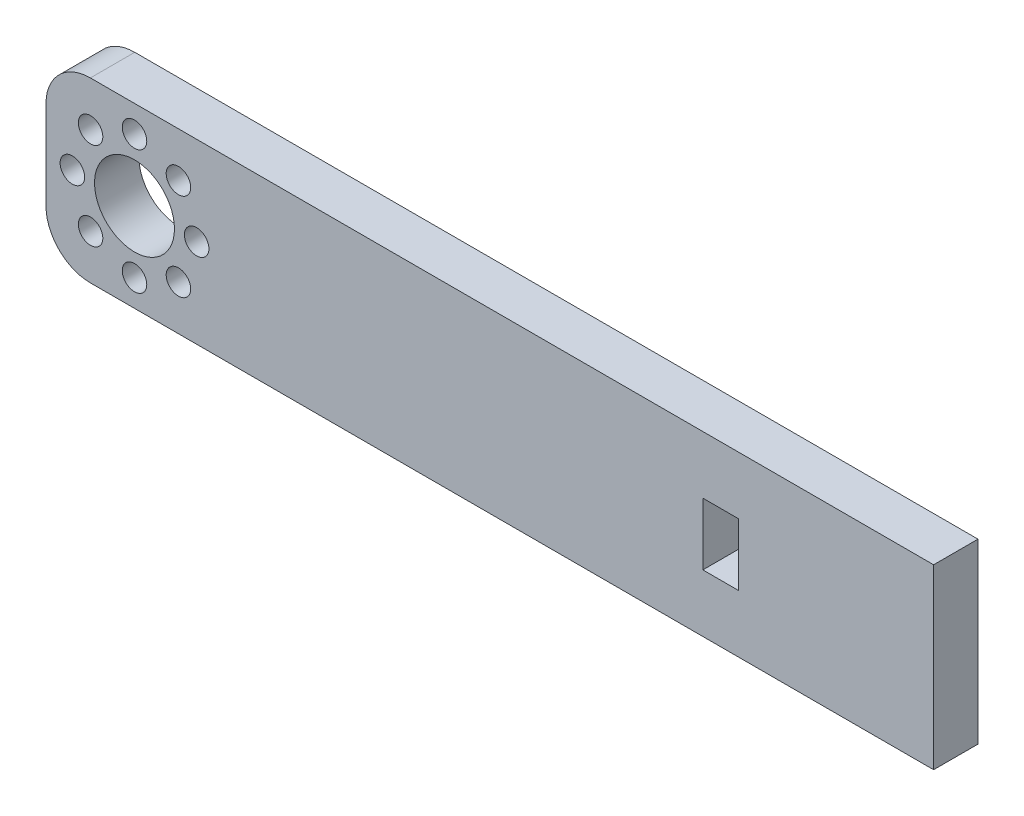
ISO-10303-21;
HEADER;
FILE_DESCRIPTION(('STEP AP214'),'2;1');
FILE_NAME('part.step','',(''),(''),'','','');
FILE_SCHEMA(('AUTOMOTIVE_DESIGN { 1 0 10303 214 1 1 1 1 }'));
ENDSEC;
DATA;
#1=APPLICATION_CONTEXT('core data for automotive mechanical design processes');
#2=APPLICATION_PROTOCOL_DEFINITION('international standard','automotive_design',2000,#1);
#3=PRODUCT_CONTEXT('',#1,'mechanical');
#4=PRODUCT('Part','Part','',(#3));
#5=PRODUCT_RELATED_PRODUCT_CATEGORY('part','',(#4));
#6=PRODUCT_DEFINITION_FORMATION('','',#4);
#7=PRODUCT_DEFINITION_CONTEXT('part definition',#1,'design');
#8=PRODUCT_DEFINITION('design','',#6,#7);
#9=PRODUCT_DEFINITION_SHAPE('','',#8);
#10=(LENGTH_UNIT() NAMED_UNIT(*) SI_UNIT(.MILLI.,.METRE.));
#11=(NAMED_UNIT(*) PLANE_ANGLE_UNIT() SI_UNIT($,.RADIAN.));
#12=(NAMED_UNIT(*) SI_UNIT($,.STERADIAN.) SOLID_ANGLE_UNIT());
#13=UNCERTAINTY_MEASURE_WITH_UNIT(LENGTH_MEASURE(1.E-05),#10,'distance_accuracy_value','');
#14=(GEOMETRIC_REPRESENTATION_CONTEXT(3) GLOBAL_UNCERTAINTY_ASSIGNED_CONTEXT((#13)) GLOBAL_UNIT_ASSIGNED_CONTEXT((#10,
#11,#12)) REPRESENTATION_CONTEXT('',''));
#15=CARTESIAN_POINT('',(0.,0.,0.));
#16=DIRECTION('',(0.,0.,1.));
#17=DIRECTION('',(1.,0.,0.));
#18=AXIS2_PLACEMENT_3D('',#15,#16,#17);
#19=CARTESIAN_POINT('',(-60.,10.,5.));
#20=DIRECTION('',(0.,-1.,0.));
#21=DIRECTION('',(1.,0.,0.));
#22=AXIS2_PLACEMENT_3D('',#19,#20,#21);
#23=PLANE('',#22);
#24=DIRECTION('',(0.,0.,-1.));
#25=VECTOR('',#24,1.);
#26=CARTESIAN_POINT('',(40.,10.,20.));
#27=LINE('',#26,#25);
#28=CARTESIAN_POINT('',(40.,10.,5.));
#29=VERTEX_POINT('',#28);
#30=CARTESIAN_POINT('',(40.,10.,0.));
#31=VERTEX_POINT('',#30);
#32=EDGE_CURVE('E143',#29,#31,#27,.T.);
#33=ORIENTED_EDGE('',*,*,#32,.T.);
#34=DIRECTION('',(-1.,0.,0.));
#35=VECTOR('',#34,1.);
#36=CARTESIAN_POINT('',(-60.,10.,0.));
#37=LINE('',#36,#35);
#38=CARTESIAN_POINT('',(-55.,10.,0.));
#39=VERTEX_POINT('',#38);
#40=EDGE_CURVE('E203',#31,#39,#37,.T.);
#41=ORIENTED_EDGE('',*,*,#40,.T.);
#42=DIRECTION('',(0.,0.,-1.));
#43=VECTOR('',#42,1.);
#44=CARTESIAN_POINT('',(-55.,10.,5.));
#45=LINE('',#44,#43);
#46=CARTESIAN_POINT('',(-55.,10.,5.));
#47=VERTEX_POINT('',#46);
#48=EDGE_CURVE('E229',#39,#47,#45,.F.);
#49=ORIENTED_EDGE('',*,*,#48,.T.);
#50=DIRECTION('',(-1.,0.,0.));
#51=VECTOR('',#50,1.);
#52=CARTESIAN_POINT('',(-60.,10.,5.));
#53=LINE('',#52,#51);
#54=EDGE_CURVE('E204',#29,#47,#53,.T.);
#55=ORIENTED_EDGE('',*,*,#54,.F.);
#56=EDGE_LOOP('',(#33,#41,#49,#55));
#57=FACE_BOUND('',#56,.T.);
#58=ADVANCED_FACE('F33',(#57),#23,.F.);
#59=CARTESIAN_POINT('',(-60.,-9.99999999999999,5.));
#60=DIRECTION('',(0.,1.,0.));
#61=DIRECTION('',(0.,0.,1.));
#62=AXIS2_PLACEMENT_3D('',#59,#60,#61);
#63=PLANE('',#62);
#64=DIRECTION('',(0.,0.,-1.));
#65=VECTOR('',#64,1.);
#66=CARTESIAN_POINT('',(40.,-9.99999999999999,20.));
#67=LINE('',#66,#65);
#68=CARTESIAN_POINT('',(40.,-9.99999999999999,5.));
#69=VERTEX_POINT('',#68);
#70=CARTESIAN_POINT('',(40.,-9.99999999999999,0.));
#71=VERTEX_POINT('',#70);
#72=EDGE_CURVE('E141',#69,#71,#67,.T.);
#73=ORIENTED_EDGE('',*,*,#72,.F.);
#74=DIRECTION('',(1.,0.,0.));
#75=VECTOR('',#74,1.);
#76=CARTESIAN_POINT('',(-60.,-9.99999999999999,5.));
#77=LINE('',#76,#75);
#78=CARTESIAN_POINT('',(-55.,-9.99999999999999,5.));
#79=VERTEX_POINT('',#78);
#80=EDGE_CURVE('E210',#79,#69,#77,.T.);
#81=ORIENTED_EDGE('',*,*,#80,.F.);
#82=DIRECTION('',(0.,0.,-1.));
#83=VECTOR('',#82,1.);
#84=CARTESIAN_POINT('',(-55.,-9.99999999999999,5.));
#85=LINE('',#84,#83);
#86=CARTESIAN_POINT('',(-55.,-9.99999999999999,0.));
#87=VERTEX_POINT('',#86);
#88=EDGE_CURVE('E236',#79,#87,#85,.T.);
#89=ORIENTED_EDGE('',*,*,#88,.T.);
#90=DIRECTION('',(1.,0.,0.));
#91=VECTOR('',#90,1.);
#92=CARTESIAN_POINT('',(-60.,-9.99999999999999,0.));
#93=LINE('',#92,#91);
#94=EDGE_CURVE('E207',#87,#71,#93,.T.);
#95=ORIENTED_EDGE('',*,*,#94,.T.);
#96=EDGE_LOOP('',(#73,#81,#89,#95));
#97=FACE_BOUND('',#96,.T.);
#98=ADVANCED_FACE('F262',(#97),#63,.F.);
#99=CARTESIAN_POINT('',(0.,0.,5.));
#100=DIRECTION('',(0.,0.,1.));
#101=DIRECTION('',(1.,0.,0.));
#102=AXIS2_PLACEMENT_3D('',#99,#100,#101);
#103=PLANE('',#102);
#104=DIRECTION('',(0.,-1.,0.));
#105=VECTOR('',#104,1.);
#106=CARTESIAN_POINT('',(14.,3.50000000000001,5.));
#107=LINE('',#106,#105);
#108=CARTESIAN_POINT('',(14.,3.50000000000001,5.));
#109=VERTEX_POINT('',#108);
#110=CARTESIAN_POINT('',(14.,-3.49999999999999,5.));
#111=VERTEX_POINT('',#110);
#112=EDGE_CURVE('E48',#109,#111,#107,.T.);
#113=ORIENTED_EDGE('',*,*,#112,.F.);
#114=DIRECTION('',(-1.,0.,0.));
#115=VECTOR('',#114,1.);
#116=CARTESIAN_POINT('',(14.,3.50000000000001,5.));
#117=LINE('',#116,#115);
#118=CARTESIAN_POINT('',(18.,3.50000000000001,5.));
#119=VERTEX_POINT('',#118);
#120=EDGE_CURVE('E129',#119,#109,#117,.T.);
#121=ORIENTED_EDGE('',*,*,#120,.F.);
#122=DIRECTION('',(0.,1.,0.));
#123=VECTOR('',#122,1.);
#124=CARTESIAN_POINT('',(18.,3.50000000000001,5.));
#125=LINE('',#124,#123);
#126=CARTESIAN_POINT('',(18.,-3.49999999999999,5.));
#127=VERTEX_POINT('',#126);
#128=EDGE_CURVE('E113',#127,#119,#125,.T.);
#129=ORIENTED_EDGE('',*,*,#128,.F.);
#130=DIRECTION('',(1.,0.,0.));
#131=VECTOR('',#130,1.);
#132=CARTESIAN_POINT('',(14.,-3.49999999999999,5.));
#133=LINE('',#132,#131);
#134=EDGE_CURVE('E122',#111,#127,#133,.T.);
#135=ORIENTED_EDGE('',*,*,#134,.F.);
#136=EDGE_LOOP('',(#113,#121,#129,#135));
#137=FACE_BOUND('',#136,.T.);
#138=CARTESIAN_POINT('',(-50.02901077957,7.,5.));
#139=DIRECTION('',(0.,0.,1.));
#140=DIRECTION('',(1.,0.,0.));
#141=AXIS2_PLACEMENT_3D('',#138,#139,#140);
#142=CIRCLE('',#141,1.380566099755);
#143=CARTESIAN_POINT('',(-48.648444679815,7.,5.));
#144=VERTEX_POINT('',#143);
#145=EDGE_CURVE('E200',#144,#144,#142,.F.);
#146=ORIENTED_EDGE('',*,*,#145,.T.);
#147=EDGE_LOOP('',(#146));
#148=FACE_BOUND('',#147,.T.);
#149=CARTESIAN_POINT('',(-45.0792633112641,4.94974746830595,5.));
#150=DIRECTION('',(0.,0.,1.));
#151=DIRECTION('',(1.,0.,0.));
#152=AXIS2_PLACEMENT_3D('',#149,#150,#151);
#153=CIRCLE('',#152,1.380566099755);
#154=CARTESIAN_POINT('',(-43.6986972115091,4.94974746830595,5.));
#155=VERTEX_POINT('',#154);
#156=EDGE_CURVE('E197',#155,#155,#153,.F.);
#157=ORIENTED_EDGE('',*,*,#156,.T.);
#158=EDGE_LOOP('',(#157));
#159=FACE_BOUND('',#158,.T.);
#160=CARTESIAN_POINT('',(-43.0290107795698,1.66533453693773E-13,5.));
#161=DIRECTION('',(0.,0.,1.));
#162=DIRECTION('',(1.,0.,0.));
#163=AXIS2_PLACEMENT_3D('',#160,#161,#162);
#164=CIRCLE('',#163,1.380566099755);
#165=CARTESIAN_POINT('',(-41.6484446798148,1.66533453693773E-13,5.));
#166=VERTEX_POINT('',#165);
#167=EDGE_CURVE('E194',#166,#166,#164,.F.);
#168=ORIENTED_EDGE('',*,*,#167,.T.);
#169=EDGE_LOOP('',(#168));
#170=FACE_BOUND('',#169,.T.);
#171=CARTESIAN_POINT('',(-45.0792633112638,-4.94974746830573,5.));
#172=DIRECTION('',(0.,0.,1.));
#173=DIRECTION('',(1.,0.,0.));
#174=AXIS2_PLACEMENT_3D('',#171,#172,#173);
#175=CIRCLE('',#174,1.380566099755);
#176=CARTESIAN_POINT('',(-43.6986972115088,-4.94974746830573,5.));
#177=VERTEX_POINT('',#176);
#178=EDGE_CURVE('E191',#177,#177,#175,.F.);
#179=ORIENTED_EDGE('',*,*,#178,.T.);
#180=EDGE_LOOP('',(#179));
#181=FACE_BOUND('',#180,.T.);
#182=CARTESIAN_POINT('',(-50.0290107795696,-7.,5.));
#183=DIRECTION('',(0.,0.,1.));
#184=DIRECTION('',(1.,0.,0.));
#185=AXIS2_PLACEMENT_3D('',#182,#183,#184);
#186=CIRCLE('',#185,1.380566099755);
#187=CARTESIAN_POINT('',(-48.6484446798146,-7.,5.));
#188=VERTEX_POINT('',#187);
#189=EDGE_CURVE('E188',#188,#188,#186,.F.);
#190=ORIENTED_EDGE('',*,*,#189,.T.);
#191=EDGE_LOOP('',(#190));
#192=FACE_BOUND('',#191,.T.);
#193=CARTESIAN_POINT('',(-54.9787582478755,-4.94974746830593,5.));
#194=DIRECTION('',(0.,0.,1.));
#195=DIRECTION('',(1.,0.,0.));
#196=AXIS2_PLACEMENT_3D('',#193,#194,#195);
#197=CIRCLE('',#196,1.380566099755);
#198=CARTESIAN_POINT('',(-53.5981921481205,-4.94974746830593,5.));
#199=VERTEX_POINT('',#198);
#200=EDGE_CURVE('E185',#199,#199,#197,.F.);
#201=ORIENTED_EDGE('',*,*,#200,.T.);
#202=EDGE_LOOP('',(#201));
#203=FACE_BOUND('',#202,.T.);
#204=CARTESIAN_POINT('',(-57.0290107795698,-1.17961196366423E-13,5.));
#205=DIRECTION('',(0.,0.,1.));
#206=DIRECTION('',(1.,0.,0.));
#207=AXIS2_PLACEMENT_3D('',#204,#205,#206);
#208=CIRCLE('',#207,1.38056609975499);
#209=CARTESIAN_POINT('',(-55.6484446798148,-1.17961196366423E-13,5.));
#210=VERTEX_POINT('',#209);
#211=EDGE_CURVE('E182',#210,#210,#208,.F.);
#212=ORIENTED_EDGE('',*,*,#211,.T.);
#213=EDGE_LOOP('',(#212));
#214=FACE_BOUND('',#213,.T.);
#215=CARTESIAN_POINT('',(-54.9787582478757,4.94974746830575,5.));
#216=DIRECTION('',(0.,0.,1.));
#217=DIRECTION('',(1.,0.,0.));
#218=AXIS2_PLACEMENT_3D('',#215,#216,#217);
#219=CIRCLE('',#218,1.38056609975499);
#220=CARTESIAN_POINT('',(-53.5981921481207,4.94974746830575,5.));
#221=VERTEX_POINT('',#220);
#222=EDGE_CURVE('E179',#221,#221,#219,.F.);
#223=ORIENTED_EDGE('',*,*,#222,.T.);
#224=EDGE_LOOP('',(#223));
#225=FACE_BOUND('',#224,.T.);
#226=CARTESIAN_POINT('',(-50.02901077957,0.,5.));
#227=DIRECTION('',(0.,0.,1.));
#228=DIRECTION('',(1.,0.,0.));
#229=AXIS2_PLACEMENT_3D('',#226,#227,#228);
#230=CIRCLE('',#229,4.5);
#231=CARTESIAN_POINT('',(-45.52901077957,0.,5.));
#232=VERTEX_POINT('',#231);
#233=EDGE_CURVE('E176',#232,#232,#230,.F.);
#234=ORIENTED_EDGE('',*,*,#233,.T.);
#235=EDGE_LOOP('',(#234));
#236=FACE_BOUND('',#235,.T.);
#237=ORIENTED_EDGE('',*,*,#80,.T.);
#238=DIRECTION('',(0.,1.,0.));
#239=VECTOR('',#238,1.);
#240=CARTESIAN_POINT('',(40.,0.,5.));
#241=LINE('',#240,#239);
#242=EDGE_CURVE('E146',#69,#29,#241,.T.);
#243=ORIENTED_EDGE('',*,*,#242,.T.);
#244=ORIENTED_EDGE('',*,*,#54,.T.);
#245=CARTESIAN_POINT('',(-55.,5.00000000000001,5.));
#246=DIRECTION('',(0.,0.,1.));
#247=DIRECTION('',(1.,0.,0.));
#248=AXIS2_PLACEMENT_3D('',#245,#246,#247);
#249=CIRCLE('',#248,5.);
#250=CARTESIAN_POINT('',(-60.,5.00000000000001,5.));
#251=VERTEX_POINT('',#250);
#252=EDGE_CURVE('E234',#47,#251,#249,.T.);
#253=ORIENTED_EDGE('',*,*,#252,.T.);
#254=DIRECTION('',(0.,-1.,0.));
#255=VECTOR('',#254,1.);
#256=CARTESIAN_POINT('',(-60.,10.,5.));
#257=LINE('',#256,#255);
#258=CARTESIAN_POINT('',(-60.,-4.99999999999999,5.));
#259=VERTEX_POINT('',#258);
#260=EDGE_CURVE('E206',#251,#259,#257,.T.);
#261=ORIENTED_EDGE('',*,*,#260,.T.);
#262=CARTESIAN_POINT('',(-55.,-4.99999999999999,5.));
#263=DIRECTION('',(0.,0.,1.));
#264=DIRECTION('',(1.,0.,0.));
#265=AXIS2_PLACEMENT_3D('',#262,#263,#264);
#266=CIRCLE('',#265,5.);
#267=EDGE_CURVE('E232',#259,#79,#266,.T.);
#268=ORIENTED_EDGE('',*,*,#267,.T.);
#269=EDGE_LOOP('',(#237,#243,#244,#253,#261,#268));
#270=FACE_BOUND('',#269,.T.);
#271=ADVANCED_FACE('F126',(#137,#148,#159,#170,#181,#192,#203,#214,#225,#236,#270),#103,.T.);
#272=CARTESIAN_POINT('',(0.,0.,0.));
#273=DIRECTION('',(0.,0.,1.));
#274=DIRECTION('',(1.,0.,0.));
#275=AXIS2_PLACEMENT_3D('',#272,#273,#274);
#276=PLANE('',#275);
#277=DIRECTION('',(-1.,0.,0.));
#278=VECTOR('',#277,1.);
#279=CARTESIAN_POINT('',(0.,3.50000000000001,0.));
#280=LINE('',#279,#278);
#281=CARTESIAN_POINT('',(18.,3.50000000000001,0.));
#282=VERTEX_POINT('',#281);
#283=CARTESIAN_POINT('',(14.,3.50000000000001,0.));
#284=VERTEX_POINT('',#283);
#285=EDGE_CURVE('E41',#282,#284,#280,.T.);
#286=ORIENTED_EDGE('',*,*,#285,.T.);
#287=DIRECTION('',(0.,-1.,0.));
#288=VECTOR('',#287,1.);
#289=CARTESIAN_POINT('',(14.,0.,0.));
#290=LINE('',#289,#288);
#291=CARTESIAN_POINT('',(14.,-3.49999999999999,0.));
#292=VERTEX_POINT('',#291);
#293=EDGE_CURVE('E11',#284,#292,#290,.T.);
#294=ORIENTED_EDGE('',*,*,#293,.T.);
#295=DIRECTION('',(1.,0.,0.));
#296=VECTOR('',#295,1.);
#297=CARTESIAN_POINT('',(0.,-3.5,0.));
#298=LINE('',#297,#296);
#299=CARTESIAN_POINT('',(18.,-3.49999999999999,0.));
#300=VERTEX_POINT('',#299);
#301=EDGE_CURVE('E239',#292,#300,#298,.T.);
#302=ORIENTED_EDGE('',*,*,#301,.T.);
#303=DIRECTION('',(0.,1.,0.));
#304=VECTOR('',#303,1.);
#305=CARTESIAN_POINT('',(18.,0.,0.));
#306=LINE('',#305,#304);
#307=EDGE_CURVE('E116',#300,#282,#306,.T.);
#308=ORIENTED_EDGE('',*,*,#307,.T.);
#309=EDGE_LOOP('',(#286,#294,#302,#308));
#310=FACE_BOUND('',#309,.T.);
#311=CARTESIAN_POINT('',(-50.02901077957,0.,0.));
#312=DIRECTION('',(0.,0.,1.));
#313=DIRECTION('',(1.,0.,0.));
#314=AXIS2_PLACEMENT_3D('',#311,#312,#313);
#315=CIRCLE('',#314,4.5);
#316=CARTESIAN_POINT('',(-45.52901077957,0.,0.));
#317=VERTEX_POINT('',#316);
#318=EDGE_CURVE('E165',#317,#317,#315,.T.);
#319=ORIENTED_EDGE('',*,*,#318,.T.);
#320=EDGE_LOOP('',(#319));
#321=FACE_BOUND('',#320,.T.);
#322=CARTESIAN_POINT('',(-54.9787582478757,4.94974746830575,0.));
#323=DIRECTION('',(0.,0.,1.));
#324=DIRECTION('',(1.,0.,0.));
#325=AXIS2_PLACEMENT_3D('',#322,#323,#324);
#326=CIRCLE('',#325,1.38056609975499);
#327=CARTESIAN_POINT('',(-53.5981921481207,4.94974746830575,0.));
#328=VERTEX_POINT('',#327);
#329=EDGE_CURVE('E149',#328,#328,#326,.T.);
#330=ORIENTED_EDGE('',*,*,#329,.T.);
#331=EDGE_LOOP('',(#330));
#332=FACE_BOUND('',#331,.T.);
#333=CARTESIAN_POINT('',(-57.0290107795698,-1.17961196366423E-13,0.));
#334=DIRECTION('',(0.,0.,1.));
#335=DIRECTION('',(1.,0.,0.));
#336=AXIS2_PLACEMENT_3D('',#333,#334,#335);
#337=CIRCLE('',#336,1.38056609975499);
#338=CARTESIAN_POINT('',(-55.6484446798148,-1.17961196366423E-13,0.));
#339=VERTEX_POINT('',#338);
#340=EDGE_CURVE('E157',#339,#339,#337,.T.);
#341=ORIENTED_EDGE('',*,*,#340,.T.);
#342=EDGE_LOOP('',(#341));
#343=FACE_BOUND('',#342,.T.);
#344=CARTESIAN_POINT('',(-54.9787582478755,-4.94974746830593,0.));
#345=DIRECTION('',(0.,0.,1.));
#346=DIRECTION('',(1.,0.,0.));
#347=AXIS2_PLACEMENT_3D('',#344,#345,#346);
#348=CIRCLE('',#347,1.380566099755);
#349=CARTESIAN_POINT('',(-53.5981921481205,-4.94974746830593,0.));
#350=VERTEX_POINT('',#349);
#351=EDGE_CURVE('E154',#350,#350,#348,.T.);
#352=ORIENTED_EDGE('',*,*,#351,.T.);
#353=EDGE_LOOP('',(#352));
#354=FACE_BOUND('',#353,.T.);
#355=CARTESIAN_POINT('',(-50.0290107795696,-7.,0.));
#356=DIRECTION('',(0.,0.,1.));
#357=DIRECTION('',(1.,0.,0.));
#358=AXIS2_PLACEMENT_3D('',#355,#356,#357);
#359=CIRCLE('',#358,1.380566099755);
#360=CARTESIAN_POINT('',(-48.6484446798146,-7.,0.));
#361=VERTEX_POINT('',#360);
#362=EDGE_CURVE('E150',#361,#361,#359,.T.);
#363=ORIENTED_EDGE('',*,*,#362,.T.);
#364=EDGE_LOOP('',(#363));
#365=FACE_BOUND('',#364,.T.);
#366=CARTESIAN_POINT('',(-45.0792633112638,-4.94974746830573,0.));
#367=DIRECTION('',(0.,0.,1.));
#368=DIRECTION('',(1.,0.,0.));
#369=AXIS2_PLACEMENT_3D('',#366,#367,#368);
#370=CIRCLE('',#369,1.380566099755);
#371=CARTESIAN_POINT('',(-43.6986972115088,-4.94974746830573,0.));
#372=VERTEX_POINT('',#371);
#373=EDGE_CURVE('E153',#372,#372,#370,.T.);
#374=ORIENTED_EDGE('',*,*,#373,.T.);
#375=EDGE_LOOP('',(#374));
#376=FACE_BOUND('',#375,.T.);
#377=CARTESIAN_POINT('',(-43.0290107795698,1.66533453693773E-13,0.));
#378=DIRECTION('',(0.,0.,1.));
#379=DIRECTION('',(1.,0.,0.));
#380=AXIS2_PLACEMENT_3D('',#377,#378,#379);
#381=CIRCLE('',#380,1.380566099755);
#382=CARTESIAN_POINT('',(-41.6484446798148,1.66533453693773E-13,0.));
#383=VERTEX_POINT('',#382);
#384=EDGE_CURVE('E169',#383,#383,#381,.T.);
#385=ORIENTED_EDGE('',*,*,#384,.T.);
#386=EDGE_LOOP('',(#385));
#387=FACE_BOUND('',#386,.T.);
#388=CARTESIAN_POINT('',(-45.0792633112641,4.94974746830595,0.));
#389=DIRECTION('',(0.,0.,1.));
#390=DIRECTION('',(1.,0.,0.));
#391=AXIS2_PLACEMENT_3D('',#388,#389,#390);
#392=CIRCLE('',#391,1.380566099755);
#393=CARTESIAN_POINT('',(-43.6986972115091,4.94974746830595,0.));
#394=VERTEX_POINT('',#393);
#395=EDGE_CURVE('E166',#394,#394,#392,.T.);
#396=ORIENTED_EDGE('',*,*,#395,.T.);
#397=EDGE_LOOP('',(#396));
#398=FACE_BOUND('',#397,.T.);
#399=CARTESIAN_POINT('',(-50.02901077957,7.,0.));
#400=DIRECTION('',(0.,0.,1.));
#401=DIRECTION('',(1.,0.,0.));
#402=AXIS2_PLACEMENT_3D('',#399,#400,#401);
#403=CIRCLE('',#402,1.380566099755);
#404=CARTESIAN_POINT('',(-48.648444679815,7.,0.));
#405=VERTEX_POINT('',#404);
#406=EDGE_CURVE('E162',#405,#405,#403,.T.);
#407=ORIENTED_EDGE('',*,*,#406,.T.);
#408=EDGE_LOOP('',(#407));
#409=FACE_BOUND('',#408,.T.);
#410=DIRECTION('',(0.,-1.,0.));
#411=VECTOR('',#410,1.);
#412=CARTESIAN_POINT('',(40.,10.,0.));
#413=LINE('',#412,#411);
#414=EDGE_CURVE('E136',#31,#71,#413,.T.);
#415=ORIENTED_EDGE('',*,*,#414,.T.);
#416=ORIENTED_EDGE('',*,*,#94,.F.);
#417=CARTESIAN_POINT('',(-55.,-4.99999999999999,0.));
#418=DIRECTION('',(0.,0.,1.));
#419=DIRECTION('',(1.,0.,0.));
#420=AXIS2_PLACEMENT_3D('',#417,#418,#419);
#421=CIRCLE('',#420,5.);
#422=CARTESIAN_POINT('',(-60.,-4.99999999999999,0.));
#423=VERTEX_POINT('',#422);
#424=EDGE_CURVE('E224',#87,#423,#421,.F.);
#425=ORIENTED_EDGE('',*,*,#424,.T.);
#426=DIRECTION('',(0.,-1.,0.));
#427=VECTOR('',#426,1.);
#428=CARTESIAN_POINT('',(-60.,10.,0.));
#429=LINE('',#428,#427);
#430=CARTESIAN_POINT('',(-60.,5.00000000000001,0.));
#431=VERTEX_POINT('',#430);
#432=EDGE_CURVE('E215',#431,#423,#429,.T.);
#433=ORIENTED_EDGE('',*,*,#432,.F.);
#434=CARTESIAN_POINT('',(-55.,5.00000000000001,0.));
#435=DIRECTION('',(0.,0.,1.));
#436=DIRECTION('',(1.,0.,0.));
#437=AXIS2_PLACEMENT_3D('',#434,#435,#436);
#438=CIRCLE('',#437,5.);
#439=EDGE_CURVE('E226',#431,#39,#438,.F.);
#440=ORIENTED_EDGE('',*,*,#439,.T.);
#441=ORIENTED_EDGE('',*,*,#40,.F.);
#442=EDGE_LOOP('',(#415,#416,#425,#433,#440,#441));
#443=FACE_BOUND('',#442,.T.);
#444=ADVANCED_FACE('F243',(#310,#321,#332,#343,#354,#365,#376,#387,#398,#409,#443),#276,.F.);
#445=CARTESIAN_POINT('',(-60.,10.,5.));
#446=DIRECTION('',(1.,0.,0.));
#447=DIRECTION('',(0.,0.,-1.));
#448=AXIS2_PLACEMENT_3D('',#445,#446,#447);
#449=PLANE('',#448);
#450=ORIENTED_EDGE('',*,*,#260,.F.);
#451=DIRECTION('',(0.,0.,-1.));
#452=VECTOR('',#451,1.);
#453=CARTESIAN_POINT('',(-60.,5.00000000000001,5.));
#454=LINE('',#453,#452);
#455=EDGE_CURVE('E221',#251,#431,#454,.T.);
#456=ORIENTED_EDGE('',*,*,#455,.T.);
#457=ORIENTED_EDGE('',*,*,#432,.T.);
#458=DIRECTION('',(0.,0.,-1.));
#459=VECTOR('',#458,1.);
#460=CARTESIAN_POINT('',(-60.,-4.99999999999999,5.));
#461=LINE('',#460,#459);
#462=EDGE_CURVE('E213',#423,#259,#461,.F.);
#463=ORIENTED_EDGE('',*,*,#462,.T.);
#464=EDGE_LOOP('',(#450,#456,#457,#463));
#465=FACE_BOUND('',#464,.T.);
#466=ADVANCED_FACE('F271',(#465),#449,.F.);
#467=CARTESIAN_POINT('',(-55.,5.00000000000001,5.));
#468=DIRECTION('',(0.,0.,-1.));
#469=DIRECTION('',(-1.,0.,0.));
#470=AXIS2_PLACEMENT_3D('',#467,#468,#469);
#471=CYLINDRICAL_SURFACE('',#470,5.);
#472=ORIENTED_EDGE('',*,*,#252,.F.);
#473=ORIENTED_EDGE('',*,*,#48,.F.);
#474=ORIENTED_EDGE('',*,*,#439,.F.);
#475=ORIENTED_EDGE('',*,*,#455,.F.);
#476=EDGE_LOOP('',(#472,#473,#474,#475));
#477=FACE_BOUND('',#476,.T.);
#478=ADVANCED_FACE('F272',(#477),#471,.T.);
#479=CARTESIAN_POINT('',(-55.,-4.99999999999999,5.));
#480=DIRECTION('',(0.,0.,-1.));
#481=DIRECTION('',(-1.,0.,0.));
#482=AXIS2_PLACEMENT_3D('',#479,#480,#481);
#483=CYLINDRICAL_SURFACE('',#482,5.);
#484=ORIENTED_EDGE('',*,*,#267,.F.);
#485=ORIENTED_EDGE('',*,*,#462,.F.);
#486=ORIENTED_EDGE('',*,*,#424,.F.);
#487=ORIENTED_EDGE('',*,*,#88,.F.);
#488=EDGE_LOOP('',(#484,#485,#486,#487));
#489=FACE_BOUND('',#488,.T.);
#490=ADVANCED_FACE('F35',(#489),#483,.T.);
#491=CARTESIAN_POINT('',(-50.02901077957,0.,17.));
#492=DIRECTION('',(0.,0.,-1.));
#493=DIRECTION('',(-1.,0.,0.));
#494=AXIS2_PLACEMENT_3D('',#491,#492,#493);
#495=CYLINDRICAL_SURFACE('',#494,4.5);
#496=ORIENTED_EDGE('',*,*,#233,.F.);
#497=EDGE_LOOP('',(#496));
#498=FACE_BOUND('',#497,.T.);
#499=ORIENTED_EDGE('',*,*,#318,.F.);
#500=EDGE_LOOP('',(#499));
#501=FACE_BOUND('',#500,.T.);
#502=ADVANCED_FACE('F279',(#498,#501),#495,.F.);
#503=CARTESIAN_POINT('',(-54.9787582478757,4.94974746830575,17.));
#504=DIRECTION('',(0.,0.,-1.));
#505=DIRECTION('',(-1.,0.,0.));
#506=AXIS2_PLACEMENT_3D('',#503,#504,#505);
#507=CYLINDRICAL_SURFACE('',#506,1.38056609975499);
#508=ORIENTED_EDGE('',*,*,#222,.F.);
#509=EDGE_LOOP('',(#508));
#510=FACE_BOUND('',#509,.T.);
#511=ORIENTED_EDGE('',*,*,#329,.F.);
#512=EDGE_LOOP('',(#511));
#513=FACE_BOUND('',#512,.T.);
#514=ADVANCED_FACE('F306',(#510,#513),#507,.F.);
#515=CARTESIAN_POINT('',(-57.0290107795698,-1.17961196366423E-13,17.));
#516=DIRECTION('',(0.,0.,-1.));
#517=DIRECTION('',(-1.,0.,0.));
#518=AXIS2_PLACEMENT_3D('',#515,#516,#517);
#519=CYLINDRICAL_SURFACE('',#518,1.38056609975499);
#520=ORIENTED_EDGE('',*,*,#211,.F.);
#521=EDGE_LOOP('',(#520));
#522=FACE_BOUND('',#521,.T.);
#523=ORIENTED_EDGE('',*,*,#340,.F.);
#524=EDGE_LOOP('',(#523));
#525=FACE_BOUND('',#524,.T.);
#526=ADVANCED_FACE('F326',(#522,#525),#519,.F.);
#527=CARTESIAN_POINT('',(-54.9787582478755,-4.94974746830593,17.));
#528=DIRECTION('',(0.,0.,-1.));
#529=DIRECTION('',(-1.,0.,0.));
#530=AXIS2_PLACEMENT_3D('',#527,#528,#529);
#531=CYLINDRICAL_SURFACE('',#530,1.380566099755);
#532=ORIENTED_EDGE('',*,*,#200,.F.);
#533=EDGE_LOOP('',(#532));
#534=FACE_BOUND('',#533,.T.);
#535=ORIENTED_EDGE('',*,*,#351,.F.);
#536=EDGE_LOOP('',(#535));
#537=FACE_BOUND('',#536,.T.);
#538=ADVANCED_FACE('F330',(#534,#537),#531,.F.);
#539=CARTESIAN_POINT('',(-50.0290107795696,-7.,17.));
#540=DIRECTION('',(0.,0.,-1.));
#541=DIRECTION('',(-1.,0.,0.));
#542=AXIS2_PLACEMENT_3D('',#539,#540,#541);
#543=CYLINDRICAL_SURFACE('',#542,1.380566099755);
#544=ORIENTED_EDGE('',*,*,#189,.F.);
#545=EDGE_LOOP('',(#544));
#546=FACE_BOUND('',#545,.T.);
#547=ORIENTED_EDGE('',*,*,#362,.F.);
#548=EDGE_LOOP('',(#547));
#549=FACE_BOUND('',#548,.T.);
#550=ADVANCED_FACE('F312',(#546,#549),#543,.F.);
#551=CARTESIAN_POINT('',(-45.0792633112638,-4.94974746830573,17.));
#552=DIRECTION('',(0.,0.,-1.));
#553=DIRECTION('',(-1.,0.,0.));
#554=AXIS2_PLACEMENT_3D('',#551,#552,#553);
#555=CYLINDRICAL_SURFACE('',#554,1.380566099755);
#556=ORIENTED_EDGE('',*,*,#178,.F.);
#557=EDGE_LOOP('',(#556));
#558=FACE_BOUND('',#557,.T.);
#559=ORIENTED_EDGE('',*,*,#373,.F.);
#560=EDGE_LOOP('',(#559));
#561=FACE_BOUND('',#560,.T.);
#562=ADVANCED_FACE('F308',(#558,#561),#555,.F.);
#563=CARTESIAN_POINT('',(-43.0290107795698,1.66533453693773E-13,17.));
#564=DIRECTION('',(0.,0.,-1.));
#565=DIRECTION('',(-1.,0.,0.));
#566=AXIS2_PLACEMENT_3D('',#563,#564,#565);
#567=CYLINDRICAL_SURFACE('',#566,1.380566099755);
#568=ORIENTED_EDGE('',*,*,#167,.F.);
#569=EDGE_LOOP('',(#568));
#570=FACE_BOUND('',#569,.T.);
#571=ORIENTED_EDGE('',*,*,#384,.F.);
#572=EDGE_LOOP('',(#571));
#573=FACE_BOUND('',#572,.T.);
#574=ADVANCED_FACE('F311',(#570,#573),#567,.F.);
#575=CARTESIAN_POINT('',(-45.0792633112641,4.94974746830595,17.));
#576=DIRECTION('',(0.,0.,-1.));
#577=DIRECTION('',(-1.,0.,0.));
#578=AXIS2_PLACEMENT_3D('',#575,#576,#577);
#579=CYLINDRICAL_SURFACE('',#578,1.380566099755);
#580=ORIENTED_EDGE('',*,*,#156,.F.);
#581=EDGE_LOOP('',(#580));
#582=FACE_BOUND('',#581,.T.);
#583=ORIENTED_EDGE('',*,*,#395,.F.);
#584=EDGE_LOOP('',(#583));
#585=FACE_BOUND('',#584,.T.);
#586=ADVANCED_FACE('F316',(#582,#585),#579,.F.);
#587=CARTESIAN_POINT('',(-50.02901077957,7.,17.));
#588=DIRECTION('',(0.,0.,-1.));
#589=DIRECTION('',(-1.,0.,0.));
#590=AXIS2_PLACEMENT_3D('',#587,#588,#589);
#591=CYLINDRICAL_SURFACE('',#590,1.380566099755);
#592=ORIENTED_EDGE('',*,*,#145,.F.);
#593=EDGE_LOOP('',(#592));
#594=FACE_BOUND('',#593,.T.);
#595=ORIENTED_EDGE('',*,*,#406,.F.);
#596=EDGE_LOOP('',(#595));
#597=FACE_BOUND('',#596,.T.);
#598=ADVANCED_FACE('F257',(#594,#597),#591,.F.);
#599=CARTESIAN_POINT('',(40.,10.,20.));
#600=DIRECTION('',(1.,0.,0.));
#601=DIRECTION('',(0.,1.,0.));
#602=AXIS2_PLACEMENT_3D('',#599,#600,#601);
#603=PLANE('',#602);
#604=ORIENTED_EDGE('',*,*,#72,.T.);
#605=ORIENTED_EDGE('',*,*,#414,.F.);
#606=ORIENTED_EDGE('',*,*,#32,.F.);
#607=ORIENTED_EDGE('',*,*,#242,.F.);
#608=EDGE_LOOP('',(#604,#605,#606,#607));
#609=FACE_BOUND('',#608,.T.);
#610=ADVANCED_FACE('F250',(#609),#603,.T.);
#611=CARTESIAN_POINT('',(14.,3.50000000000001,-15.));
#612=DIRECTION('',(-1.,0.,0.));
#613=DIRECTION('',(0.,-1.,0.));
#614=AXIS2_PLACEMENT_3D('',#611,#612,#613);
#615=PLANE('',#614);
#616=DIRECTION('',(0.,0.,1.));
#617=VECTOR('',#616,1.);
#618=CARTESIAN_POINT('',(14.,3.50000000000001,-15.));
#619=LINE('',#618,#617);
#620=EDGE_CURVE('E134',#284,#109,#619,.T.);
#621=ORIENTED_EDGE('',*,*,#620,.T.);
#622=ORIENTED_EDGE('',*,*,#112,.T.);
#623=DIRECTION('',(0.,0.,1.));
#624=VECTOR('',#623,1.);
#625=CARTESIAN_POINT('',(14.,-3.49999999999999,-15.));
#626=LINE('',#625,#624);
#627=EDGE_CURVE('E119',#292,#111,#626,.T.);
#628=ORIENTED_EDGE('',*,*,#627,.F.);
#629=ORIENTED_EDGE('',*,*,#293,.F.);
#630=EDGE_LOOP('',(#621,#622,#628,#629));
#631=FACE_BOUND('',#630,.T.);
#632=ADVANCED_FACE('F248',(#631),#615,.F.);
#633=CARTESIAN_POINT('',(14.,3.50000000000001,-15.));
#634=DIRECTION('',(0.,1.,0.));
#635=DIRECTION('',(-1.,0.,0.));
#636=AXIS2_PLACEMENT_3D('',#633,#634,#635);
#637=PLANE('',#636);
#638=DIRECTION('',(0.,0.,1.));
#639=VECTOR('',#638,1.);
#640=CARTESIAN_POINT('',(18.,3.50000000000001,-15.));
#641=LINE('',#640,#639);
#642=EDGE_CURVE('E118',#282,#119,#641,.T.);
#643=ORIENTED_EDGE('',*,*,#642,.T.);
#644=ORIENTED_EDGE('',*,*,#120,.T.);
#645=ORIENTED_EDGE('',*,*,#620,.F.);
#646=ORIENTED_EDGE('',*,*,#285,.F.);
#647=EDGE_LOOP('',(#643,#644,#645,#646));
#648=FACE_BOUND('',#647,.T.);
#649=ADVANCED_FACE('F247',(#648),#637,.F.);
#650=CARTESIAN_POINT('',(18.,3.50000000000001,-15.));
#651=DIRECTION('',(1.,0.,0.));
#652=DIRECTION('',(0.,1.,0.));
#653=AXIS2_PLACEMENT_3D('',#650,#651,#652);
#654=PLANE('',#653);
#655=DIRECTION('',(0.,0.,1.));
#656=VECTOR('',#655,1.);
#657=CARTESIAN_POINT('',(18.,-3.49999999999999,-15.));
#658=LINE('',#657,#656);
#659=EDGE_CURVE('E56',#300,#127,#658,.T.);
#660=ORIENTED_EDGE('',*,*,#659,.T.);
#661=ORIENTED_EDGE('',*,*,#128,.T.);
#662=ORIENTED_EDGE('',*,*,#642,.F.);
#663=ORIENTED_EDGE('',*,*,#307,.F.);
#664=EDGE_LOOP('',(#660,#661,#662,#663));
#665=FACE_BOUND('',#664,.T.);
#666=ADVANCED_FACE('F110',(#665),#654,.F.);
#667=CARTESIAN_POINT('',(14.,-3.49999999999999,-15.));
#668=DIRECTION('',(0.,-1.,0.));
#669=DIRECTION('',(1.,0.,0.));
#670=AXIS2_PLACEMENT_3D('',#667,#668,#669);
#671=PLANE('',#670);
#672=ORIENTED_EDGE('',*,*,#627,.T.);
#673=ORIENTED_EDGE('',*,*,#134,.T.);
#674=ORIENTED_EDGE('',*,*,#659,.F.);
#675=ORIENTED_EDGE('',*,*,#301,.F.);
#676=EDGE_LOOP('',(#672,#673,#674,#675));
#677=FACE_BOUND('',#676,.T.);
#678=ADVANCED_FACE('F123',(#677),#671,.F.);
#679=CLOSED_SHELL('',(#58,#98,#271,#444,#466,#478,#490,#502,#514,#526,#538,#550,#562,#574,#586,
#598,#610,#632,#649,#666,#678));
#680=MANIFOLD_SOLID_BREP('B2',#679);
#681=ADVANCED_BREP_SHAPE_REPRESENTATION('',(#18,#680),#14);
#682=SHAPE_DEFINITION_REPRESENTATION(#9,#681);
ENDSEC;
END-ISO-10303-21;
